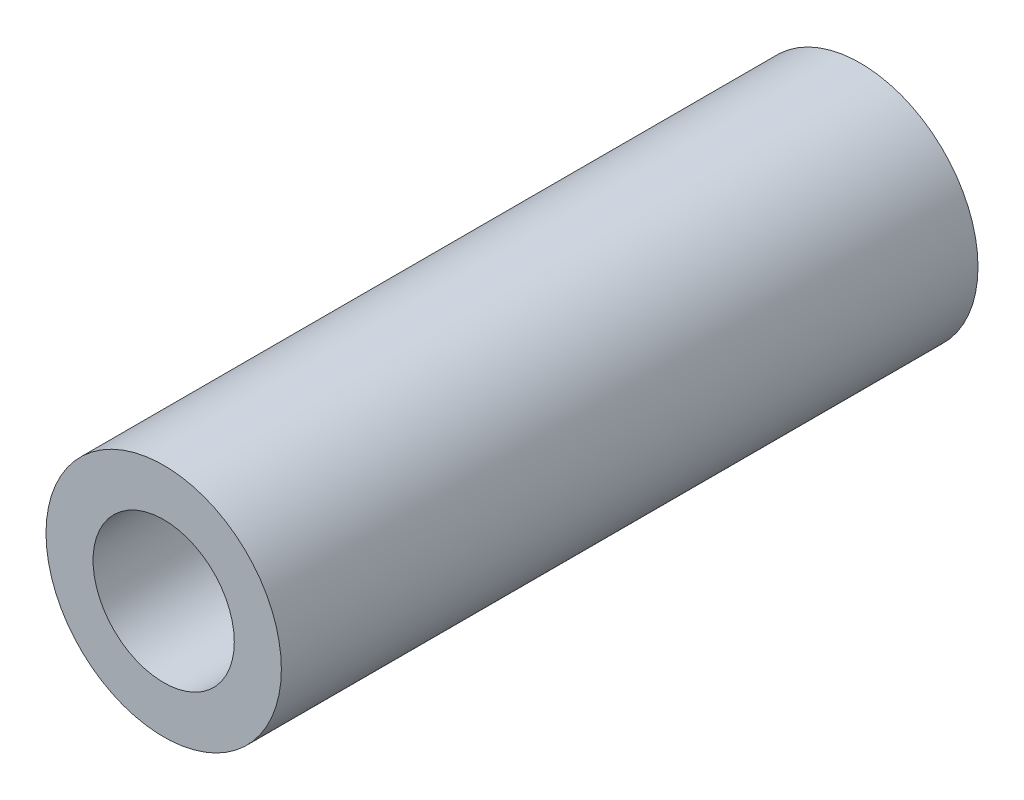
ISO-10303-21;
HEADER;
FILE_DESCRIPTION(('STEP AP214'),'2;1');
FILE_NAME('part.step','',(''),(''),'','','');
FILE_SCHEMA(('AUTOMOTIVE_DESIGN { 1 0 10303 214 1 1 1 1 }'));
ENDSEC;
DATA;
#1=APPLICATION_CONTEXT('core data for automotive mechanical design processes');
#2=APPLICATION_PROTOCOL_DEFINITION('international standard','automotive_design',2000,#1);
#3=PRODUCT_CONTEXT('',#1,'mechanical');
#4=PRODUCT('Part','Part','',(#3));
#5=PRODUCT_RELATED_PRODUCT_CATEGORY('part','',(#4));
#6=PRODUCT_DEFINITION_FORMATION('','',#4);
#7=PRODUCT_DEFINITION_CONTEXT('part definition',#1,'design');
#8=PRODUCT_DEFINITION('design','',#6,#7);
#9=PRODUCT_DEFINITION_SHAPE('','',#8);
#10=(LENGTH_UNIT() NAMED_UNIT(*) SI_UNIT(.MILLI.,.METRE.));
#11=(NAMED_UNIT(*) PLANE_ANGLE_UNIT() SI_UNIT($,.RADIAN.));
#12=(NAMED_UNIT(*) SI_UNIT($,.STERADIAN.) SOLID_ANGLE_UNIT());
#13=UNCERTAINTY_MEASURE_WITH_UNIT(LENGTH_MEASURE(1.E-05),#10,'distance_accuracy_value','');
#14=(GEOMETRIC_REPRESENTATION_CONTEXT(3) GLOBAL_UNCERTAINTY_ASSIGNED_CONTEXT((#13)) GLOBAL_UNIT_ASSIGNED_CONTEXT((#10,
#11,#12)) REPRESENTATION_CONTEXT('',''));
#15=CARTESIAN_POINT('',(0.,0.,0.));
#16=DIRECTION('',(0.,0.,1.));
#17=DIRECTION('',(1.,0.,0.));
#18=AXIS2_PLACEMENT_3D('',#15,#16,#17);
#19=CARTESIAN_POINT('',(0.,0.,29.6));
#20=DIRECTION('',(0.,0.,1.));
#21=DIRECTION('',(1.,0.,0.));
#22=AXIS2_PLACEMENT_3D('',#19,#20,#21);
#23=PLANE('',#22);
#24=CARTESIAN_POINT('',(0.,0.,29.6));
#25=DIRECTION('',(0.,0.,1.));
#26=DIRECTION('',(1.,0.,0.));
#27=AXIS2_PLACEMENT_3D('',#24,#25,#26);
#28=CIRCLE('',#27,5.);
#29=CARTESIAN_POINT('',(5.,0.,29.6));
#30=VERTEX_POINT('',#29);
#31=EDGE_CURVE('E10',#30,#30,#28,.T.);
#32=ORIENTED_EDGE('',*,*,#31,.T.);
#33=EDGE_LOOP('',(#32));
#34=FACE_BOUND('',#33,.T.);
#35=CARTESIAN_POINT('',(0.,0.,29.6));
#36=DIRECTION('',(0.,0.,1.));
#37=DIRECTION('',(1.,0.,0.));
#38=AXIS2_PLACEMENT_3D('',#35,#36,#37);
#39=CIRCLE('',#38,3.);
#40=CARTESIAN_POINT('',(3.,0.,29.6));
#41=VERTEX_POINT('',#40);
#42=EDGE_CURVE('E42',#41,#41,#39,.T.);
#43=ORIENTED_EDGE('',*,*,#42,.F.);
#44=EDGE_LOOP('',(#43));
#45=FACE_BOUND('',#44,.T.);
#46=ADVANCED_FACE('F31',(#34,#45),#23,.T.);
#47=CARTESIAN_POINT('',(0.,0.,0.));
#48=DIRECTION('',(0.,0.,1.));
#49=DIRECTION('',(1.,0.,0.));
#50=AXIS2_PLACEMENT_3D('',#47,#48,#49);
#51=PLANE('',#50);
#52=CARTESIAN_POINT('',(0.,0.,0.));
#53=DIRECTION('',(0.,0.,1.));
#54=DIRECTION('',(1.,0.,0.));
#55=AXIS2_PLACEMENT_3D('',#52,#53,#54);
#56=CIRCLE('',#55,5.);
#57=CARTESIAN_POINT('',(5.,0.,0.));
#58=VERTEX_POINT('',#57);
#59=EDGE_CURVE('E35',#58,#58,#56,.T.);
#60=ORIENTED_EDGE('',*,*,#59,.F.);
#61=EDGE_LOOP('',(#60));
#62=FACE_BOUND('',#61,.T.);
#63=CARTESIAN_POINT('',(0.,0.,0.));
#64=DIRECTION('',(0.,0.,1.));
#65=DIRECTION('',(1.,0.,0.));
#66=AXIS2_PLACEMENT_3D('',#63,#64,#65);
#67=CIRCLE('',#66,3.);
#68=CARTESIAN_POINT('',(3.,0.,0.));
#69=VERTEX_POINT('',#68);
#70=EDGE_CURVE('E44',#69,#69,#67,.T.);
#71=ORIENTED_EDGE('',*,*,#70,.T.);
#72=EDGE_LOOP('',(#71));
#73=FACE_BOUND('',#72,.T.);
#74=ADVANCED_FACE('F54',(#62,#73),#51,.F.);
#75=CARTESIAN_POINT('',(0.,0.,29.6));
#76=DIRECTION('',(0.,0.,-1.));
#77=DIRECTION('',(-1.,0.,0.));
#78=AXIS2_PLACEMENT_3D('',#75,#76,#77);
#79=CYLINDRICAL_SURFACE('',#78,5.);
#80=ORIENTED_EDGE('',*,*,#31,.F.);
#81=EDGE_LOOP('',(#80));
#82=FACE_BOUND('',#81,.T.);
#83=ORIENTED_EDGE('',*,*,#59,.T.);
#84=EDGE_LOOP('',(#83));
#85=FACE_BOUND('',#84,.T.);
#86=ADVANCED_FACE('F33',(#82,#85),#79,.T.);
#87=CARTESIAN_POINT('',(0.,0.,29.6));
#88=DIRECTION('',(0.,0.,-1.));
#89=DIRECTION('',(-1.,0.,0.));
#90=AXIS2_PLACEMENT_3D('',#87,#88,#89);
#91=CYLINDRICAL_SURFACE('',#90,3.);
#92=ORIENTED_EDGE('',*,*,#42,.T.);
#93=EDGE_LOOP('',(#92));
#94=FACE_BOUND('',#93,.T.);
#95=ORIENTED_EDGE('',*,*,#70,.F.);
#96=EDGE_LOOP('',(#95));
#97=FACE_BOUND('',#96,.T.);
#98=ADVANCED_FACE('F50',(#94,#97),#91,.F.);
#99=CLOSED_SHELL('',(#46,#74,#86,#98));
#100=MANIFOLD_SOLID_BREP('B2',#99);
#101=ADVANCED_BREP_SHAPE_REPRESENTATION('',(#18,#100),#14);
#102=SHAPE_DEFINITION_REPRESENTATION(#9,#101);
ENDSEC;
END-ISO-10303-21;
